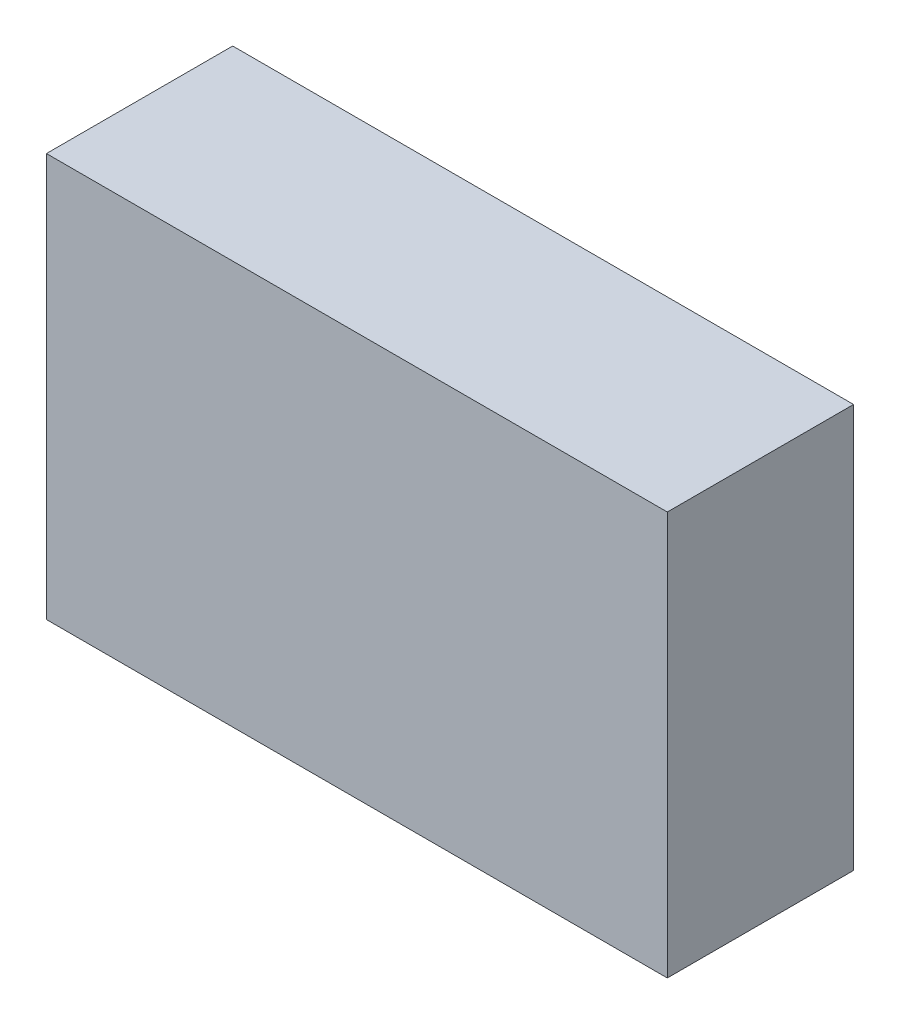
ISO-10303-21;
HEADER;
FILE_DESCRIPTION(('STEP AP214'),'2;1');
FILE_NAME('part.step','',(''),(''),'','','');
FILE_SCHEMA(('AUTOMOTIVE_DESIGN { 1 0 10303 214 1 1 1 1 }'));
ENDSEC;
DATA;
#1=APPLICATION_CONTEXT('core data for automotive mechanical design processes');
#2=APPLICATION_PROTOCOL_DEFINITION('international standard','automotive_design',2000,#1);
#3=PRODUCT_CONTEXT('',#1,'mechanical');
#4=PRODUCT('Part','Part','',(#3));
#5=PRODUCT_RELATED_PRODUCT_CATEGORY('part','',(#4));
#6=PRODUCT_DEFINITION_FORMATION('','',#4);
#7=PRODUCT_DEFINITION_CONTEXT('part definition',#1,'design');
#8=PRODUCT_DEFINITION('design','',#6,#7);
#9=PRODUCT_DEFINITION_SHAPE('','',#8);
#10=(LENGTH_UNIT() NAMED_UNIT(*) SI_UNIT(.MILLI.,.METRE.));
#11=(NAMED_UNIT(*) PLANE_ANGLE_UNIT() SI_UNIT($,.RADIAN.));
#12=(NAMED_UNIT(*) SI_UNIT($,.STERADIAN.) SOLID_ANGLE_UNIT());
#13=UNCERTAINTY_MEASURE_WITH_UNIT(LENGTH_MEASURE(1.E-05),#10,'distance_accuracy_value','');
#14=(GEOMETRIC_REPRESENTATION_CONTEXT(3) GLOBAL_UNCERTAINTY_ASSIGNED_CONTEXT((#13)) GLOBAL_UNIT_ASSIGNED_CONTEXT((#10,
#11,#12)) REPRESENTATION_CONTEXT('',''));
#15=CARTESIAN_POINT('',(0.,0.,0.));
#16=DIRECTION('',(0.,0.,1.));
#17=DIRECTION('',(1.,0.,0.));
#18=AXIS2_PLACEMENT_3D('',#15,#16,#17);
#19=CARTESIAN_POINT('',(0.,0.,0.6));
#20=DIRECTION('',(0.,0.,1.));
#21=DIRECTION('',(1.,0.,0.));
#22=AXIS2_PLACEMENT_3D('',#19,#20,#21);
#23=PLANE('',#22);
#24=DIRECTION('',(0.,-1.,0.));
#25=VECTOR('',#24,1.);
#26=CARTESIAN_POINT('',(1.,0.,0.6));
#27=LINE('',#26,#25);
#28=CARTESIAN_POINT('',(1.,0.65,0.6));
#29=VERTEX_POINT('',#28);
#30=CARTESIAN_POINT('',(1.,-0.65,0.6));
#31=VERTEX_POINT('',#30);
#32=EDGE_CURVE('E35',#29,#31,#27,.T.);
#33=ORIENTED_EDGE('',*,*,#32,.F.);
#34=DIRECTION('',(-1.,0.,0.));
#35=VECTOR('',#34,1.);
#36=CARTESIAN_POINT('',(-1.5,0.65,0.6));
#37=LINE('',#36,#35);
#38=CARTESIAN_POINT('',(-1.,0.65,0.6));
#39=VERTEX_POINT('',#38);
#40=EDGE_CURVE('E11',#29,#39,#37,.T.);
#41=ORIENTED_EDGE('',*,*,#40,.T.);
#42=DIRECTION('',(0.,-1.,0.));
#43=VECTOR('',#42,1.);
#44=CARTESIAN_POINT('',(-1.,0.,0.6));
#45=LINE('',#44,#43);
#46=CARTESIAN_POINT('',(-1.,-0.65,0.6));
#47=VERTEX_POINT('',#46);
#48=EDGE_CURVE('E27',#39,#47,#45,.T.);
#49=ORIENTED_EDGE('',*,*,#48,.T.);
#50=DIRECTION('',(1.,0.,0.));
#51=VECTOR('',#50,1.);
#52=CARTESIAN_POINT('',(1.5,-0.65,0.6));
#53=LINE('',#52,#51);
#54=EDGE_CURVE('E81',#47,#31,#53,.T.);
#55=ORIENTED_EDGE('',*,*,#54,.T.);
#56=EDGE_LOOP('',(#33,#41,#49,#55));
#57=FACE_BOUND('',#56,.T.);
#58=ADVANCED_FACE('F17',(#57),#23,.T.);
#59=CARTESIAN_POINT('',(1.5,0.65,0.));
#60=DIRECTION('',(0.,1.,0.));
#61=DIRECTION('',(-1.,0.,0.));
#62=AXIS2_PLACEMENT_3D('',#59,#60,#61);
#63=PLANE('',#62);
#64=DIRECTION('',(0.,0.,1.));
#65=VECTOR('',#64,1.);
#66=CARTESIAN_POINT('',(1.,0.65,0.15));
#67=LINE('',#66,#65);
#68=CARTESIAN_POINT('',(1.,0.65,0.));
#69=VERTEX_POINT('',#68);
#70=EDGE_CURVE('E76',#69,#29,#67,.T.);
#71=ORIENTED_EDGE('',*,*,#70,.F.);
#72=DIRECTION('',(1.,0.,0.));
#73=VECTOR('',#72,1.);
#74=CARTESIAN_POINT('',(-1.5,0.65,0.));
#75=LINE('',#74,#73);
#76=CARTESIAN_POINT('',(-1.,0.65,0.));
#77=VERTEX_POINT('',#76);
#78=EDGE_CURVE('E67',#77,#69,#75,.T.);
#79=ORIENTED_EDGE('',*,*,#78,.F.);
#80=DIRECTION('',(0.,0.,1.));
#81=VECTOR('',#80,1.);
#82=CARTESIAN_POINT('',(-1.,0.65,0.15));
#83=LINE('',#82,#81);
#84=EDGE_CURVE('E84',#77,#39,#83,.T.);
#85=ORIENTED_EDGE('',*,*,#84,.T.);
#86=ORIENTED_EDGE('',*,*,#40,.F.);
#87=EDGE_LOOP('',(#71,#79,#85,#86));
#88=FACE_BOUND('',#87,.T.);
#89=ADVANCED_FACE('F92',(#88),#63,.T.);
#90=CARTESIAN_POINT('',(-1.,0.,0.3));
#91=DIRECTION('',(1.,0.,0.));
#92=DIRECTION('',(0.,0.,-1.));
#93=AXIS2_PLACEMENT_3D('',#90,#91,#92);
#94=PLANE('',#93);
#95=ORIENTED_EDGE('',*,*,#84,.F.);
#96=DIRECTION('',(0.,1.,0.));
#97=VECTOR('',#96,1.);
#98=CARTESIAN_POINT('',(-1.,0.,0.));
#99=LINE('',#98,#97);
#100=CARTESIAN_POINT('',(-1.,-0.65,0.));
#101=VERTEX_POINT('',#100);
#102=EDGE_CURVE('E56',#101,#77,#99,.T.);
#103=ORIENTED_EDGE('',*,*,#102,.F.);
#104=DIRECTION('',(0.,0.,-1.));
#105=VECTOR('',#104,1.);
#106=CARTESIAN_POINT('',(-1.,-0.65,0.15));
#107=LINE('',#106,#105);
#108=EDGE_CURVE('E72',#47,#101,#107,.T.);
#109=ORIENTED_EDGE('',*,*,#108,.F.);
#110=ORIENTED_EDGE('',*,*,#48,.F.);
#111=EDGE_LOOP('',(#95,#103,#109,#110));
#112=FACE_BOUND('',#111,.T.);
#113=ADVANCED_FACE('F90',(#112),#94,.F.);
#114=CARTESIAN_POINT('',(-1.5,-0.65,0.));
#115=DIRECTION('',(0.,-1.,0.));
#116=DIRECTION('',(1.,0.,0.));
#117=AXIS2_PLACEMENT_3D('',#114,#115,#116);
#118=PLANE('',#117);
#119=DIRECTION('',(0.,0.,-1.));
#120=VECTOR('',#119,1.);
#121=CARTESIAN_POINT('',(1.,-0.65,0.15));
#122=LINE('',#121,#120);
#123=CARTESIAN_POINT('',(1.,-0.65,0.));
#124=VERTEX_POINT('',#123);
#125=EDGE_CURVE('E62',#31,#124,#122,.T.);
#126=ORIENTED_EDGE('',*,*,#125,.F.);
#127=ORIENTED_EDGE('',*,*,#54,.F.);
#128=ORIENTED_EDGE('',*,*,#108,.T.);
#129=DIRECTION('',(-1.,0.,0.));
#130=VECTOR('',#129,1.);
#131=CARTESIAN_POINT('',(1.5,-0.65,0.));
#132=LINE('',#131,#130);
#133=EDGE_CURVE('E70',#124,#101,#132,.T.);
#134=ORIENTED_EDGE('',*,*,#133,.F.);
#135=EDGE_LOOP('',(#126,#127,#128,#134));
#136=FACE_BOUND('',#135,.T.);
#137=ADVANCED_FACE('F71',(#136),#118,.T.);
#138=CARTESIAN_POINT('',(0.,0.,0.));
#139=DIRECTION('',(0.,0.,1.));
#140=DIRECTION('',(1.,0.,0.));
#141=AXIS2_PLACEMENT_3D('',#138,#139,#140);
#142=PLANE('',#141);
#143=DIRECTION('',(0.,1.,0.));
#144=VECTOR('',#143,1.);
#145=CARTESIAN_POINT('',(1.,0.,0.));
#146=LINE('',#145,#144);
#147=EDGE_CURVE('E21',#124,#69,#146,.T.);
#148=ORIENTED_EDGE('',*,*,#147,.F.);
#149=ORIENTED_EDGE('',*,*,#133,.T.);
#150=ORIENTED_EDGE('',*,*,#102,.T.);
#151=ORIENTED_EDGE('',*,*,#78,.T.);
#152=EDGE_LOOP('',(#148,#149,#150,#151));
#153=FACE_BOUND('',#152,.T.);
#154=ADVANCED_FACE('F75',(#153),#142,.F.);
#155=CARTESIAN_POINT('',(1.,0.,0.3));
#156=DIRECTION('',(1.,0.,0.));
#157=DIRECTION('',(0.,0.,-1.));
#158=AXIS2_PLACEMENT_3D('',#155,#156,#157);
#159=PLANE('',#158);
#160=ORIENTED_EDGE('',*,*,#125,.T.);
#161=ORIENTED_EDGE('',*,*,#147,.T.);
#162=ORIENTED_EDGE('',*,*,#70,.T.);
#163=ORIENTED_EDGE('',*,*,#32,.T.);
#164=EDGE_LOOP('',(#160,#161,#162,#163));
#165=FACE_BOUND('',#164,.T.);
#166=ADVANCED_FACE('F19',(#165),#159,.T.);
#167=CLOSED_SHELL('',(#58,#89,#113,#137,#154,#166));
#168=MANIFOLD_SOLID_BREP('B1',#167);
#169=ADVANCED_BREP_SHAPE_REPRESENTATION('',(#18,#168),#14);
#170=SHAPE_DEFINITION_REPRESENTATION(#9,#169);
ENDSEC;
END-ISO-10303-21;
